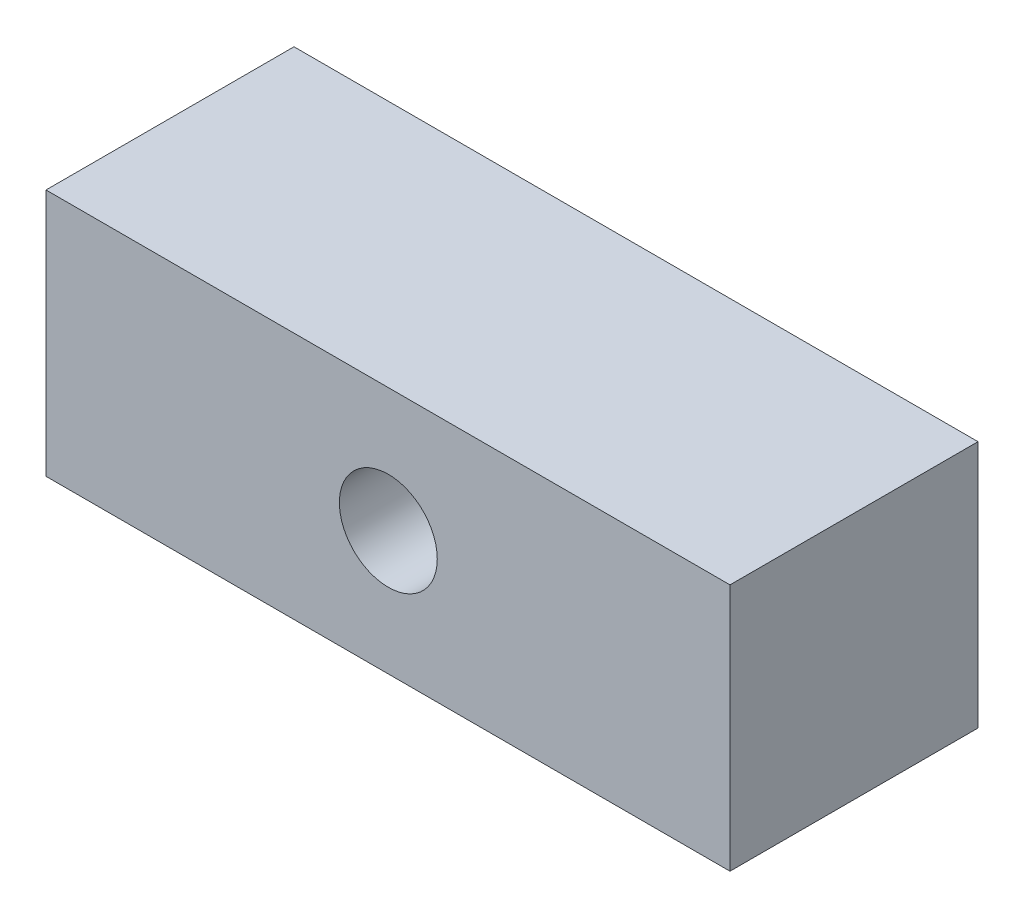
ISO-10303-21;
HEADER;
FILE_DESCRIPTION(('STEP AP214'),'2;1');
FILE_NAME('part.step','',(''),(''),'','','');
FILE_SCHEMA(('AUTOMOTIVE_DESIGN { 1 0 10303 214 1 1 1 1 }'));
ENDSEC;
DATA;
#1=APPLICATION_CONTEXT('core data for automotive mechanical design processes');
#2=APPLICATION_PROTOCOL_DEFINITION('international standard','automotive_design',2000,#1);
#3=PRODUCT_CONTEXT('',#1,'mechanical');
#4=PRODUCT('Part','Part','',(#3));
#5=PRODUCT_RELATED_PRODUCT_CATEGORY('part','',(#4));
#6=PRODUCT_DEFINITION_FORMATION('','',#4);
#7=PRODUCT_DEFINITION_CONTEXT('part definition',#1,'design');
#8=PRODUCT_DEFINITION('design','',#6,#7);
#9=PRODUCT_DEFINITION_SHAPE('','',#8);
#10=(LENGTH_UNIT() NAMED_UNIT(*) SI_UNIT(.MILLI.,.METRE.));
#11=(NAMED_UNIT(*) PLANE_ANGLE_UNIT() SI_UNIT($,.RADIAN.));
#12=(NAMED_UNIT(*) SI_UNIT($,.STERADIAN.) SOLID_ANGLE_UNIT());
#13=UNCERTAINTY_MEASURE_WITH_UNIT(LENGTH_MEASURE(1.E-05),#10,'distance_accuracy_value','');
#14=(GEOMETRIC_REPRESENTATION_CONTEXT(3) GLOBAL_UNCERTAINTY_ASSIGNED_CONTEXT((#13)) GLOBAL_UNIT_ASSIGNED_CONTEXT((#10,
#11,#12)) REPRESENTATION_CONTEXT('',''));
#15=CARTESIAN_POINT('',(0.,0.,0.));
#16=DIRECTION('',(0.,0.,1.));
#17=DIRECTION('',(1.,0.,0.));
#18=AXIS2_PLACEMENT_3D('',#15,#16,#17);
#19=CARTESIAN_POINT('',(0.,0.,38.));
#20=DIRECTION('',(0.,0.,-1.));
#21=DIRECTION('',(-1.,0.,0.));
#22=AXIS2_PLACEMENT_3D('',#19,#20,#21);
#23=PLANE('',#22);
#24=DIRECTION('',(0.,-1.,0.));
#25=VECTOR('',#24,1.);
#26=CARTESIAN_POINT('',(0.,0.,38.));
#27=LINE('',#26,#25);
#28=CARTESIAN_POINT('',(0.,38.,38.));
#29=VERTEX_POINT('',#28);
#30=CARTESIAN_POINT('',(0.,0.,38.));
#31=VERTEX_POINT('',#30);
#32=EDGE_CURVE('E92',#29,#31,#27,.T.);
#33=ORIENTED_EDGE('',*,*,#32,.T.);
#34=DIRECTION('',(1.,0.,0.));
#35=VECTOR('',#34,1.);
#36=CARTESIAN_POINT('',(0.,0.,38.));
#37=LINE('',#36,#35);
#38=CARTESIAN_POINT('',(104.8,0.,38.));
#39=VERTEX_POINT('',#38);
#40=EDGE_CURVE('E87',#31,#39,#37,.T.);
#41=ORIENTED_EDGE('',*,*,#40,.T.);
#42=DIRECTION('',(0.,1.,0.));
#43=VECTOR('',#42,1.);
#44=CARTESIAN_POINT('',(104.8,0.,38.));
#45=LINE('',#44,#43);
#46=CARTESIAN_POINT('',(104.8,38.,38.));
#47=VERTEX_POINT('',#46);
#48=EDGE_CURVE('E90',#39,#47,#45,.T.);
#49=ORIENTED_EDGE('',*,*,#48,.T.);
#50=DIRECTION('',(-1.,0.,0.));
#51=VECTOR('',#50,1.);
#52=CARTESIAN_POINT('',(0.,38.,38.));
#53=LINE('',#52,#51);
#54=EDGE_CURVE('E57',#47,#29,#53,.T.);
#55=ORIENTED_EDGE('',*,*,#54,.T.);
#56=EDGE_LOOP('',(#33,#41,#49,#55));
#57=FACE_BOUND('',#56,.T.);
#58=CARTESIAN_POINT('',(52.45,19.,38.));
#59=DIRECTION('',(0.,0.,1.));
#60=DIRECTION('',(1.,0.,0.));
#61=AXIS2_PLACEMENT_3D('',#58,#59,#60);
#62=CIRCLE('',#61,7.5);
#63=CARTESIAN_POINT('',(59.95,19.,38.));
#64=VERTEX_POINT('',#63);
#65=EDGE_CURVE('E112',#64,#64,#62,.T.);
#66=ORIENTED_EDGE('',*,*,#65,.F.);
#67=EDGE_LOOP('',(#66));
#68=FACE_BOUND('',#67,.T.);
#69=ADVANCED_FACE('F39',(#57,#68),#23,.F.);
#70=CARTESIAN_POINT('',(0.,0.,0.));
#71=DIRECTION('',(0.,0.,-1.));
#72=DIRECTION('',(-1.,0.,0.));
#73=AXIS2_PLACEMENT_3D('',#70,#71,#72);
#74=PLANE('',#73);
#75=DIRECTION('',(0.,-1.,0.));
#76=VECTOR('',#75,1.);
#77=CARTESIAN_POINT('',(0.,0.,0.));
#78=LINE('',#77,#76);
#79=CARTESIAN_POINT('',(0.,38.,0.));
#80=VERTEX_POINT('',#79);
#81=CARTESIAN_POINT('',(0.,0.,0.));
#82=VERTEX_POINT('',#81);
#83=EDGE_CURVE('E108',#80,#82,#78,.T.);
#84=ORIENTED_EDGE('',*,*,#83,.F.);
#85=DIRECTION('',(-1.,0.,0.));
#86=VECTOR('',#85,1.);
#87=CARTESIAN_POINT('',(0.,38.,0.));
#88=LINE('',#87,#86);
#89=CARTESIAN_POINT('',(104.8,38.,0.));
#90=VERTEX_POINT('',#89);
#91=EDGE_CURVE('E80',#90,#80,#88,.T.);
#92=ORIENTED_EDGE('',*,*,#91,.F.);
#93=DIRECTION('',(0.,1.,0.));
#94=VECTOR('',#93,1.);
#95=CARTESIAN_POINT('',(104.8,0.,0.));
#96=LINE('',#95,#94);
#97=CARTESIAN_POINT('',(104.8,0.,0.));
#98=VERTEX_POINT('',#97);
#99=EDGE_CURVE('E74',#98,#90,#96,.T.);
#100=ORIENTED_EDGE('',*,*,#99,.F.);
#101=DIRECTION('',(1.,0.,0.));
#102=VECTOR('',#101,1.);
#103=CARTESIAN_POINT('',(0.,0.,0.));
#104=LINE('',#103,#102);
#105=EDGE_CURVE('E97',#82,#98,#104,.T.);
#106=ORIENTED_EDGE('',*,*,#105,.F.);
#107=EDGE_LOOP('',(#84,#92,#100,#106));
#108=FACE_BOUND('',#107,.T.);
#109=CARTESIAN_POINT('',(52.45,19.,0.));
#110=DIRECTION('',(0.,0.,1.));
#111=DIRECTION('',(1.,0.,0.));
#112=AXIS2_PLACEMENT_3D('',#109,#110,#111);
#113=CIRCLE('',#112,7.5);
#114=CARTESIAN_POINT('',(59.95,19.,0.));
#115=VERTEX_POINT('',#114);
#116=EDGE_CURVE('E130',#115,#115,#113,.T.);
#117=ORIENTED_EDGE('',*,*,#116,.T.);
#118=EDGE_LOOP('',(#117));
#119=FACE_BOUND('',#118,.T.);
#120=ADVANCED_FACE('F125',(#108,#119),#74,.T.);
#121=CARTESIAN_POINT('',(0.,0.,38.));
#122=DIRECTION('',(1.,0.,0.));
#123=DIRECTION('',(0.,0.,-1.));
#124=AXIS2_PLACEMENT_3D('',#121,#122,#123);
#125=PLANE('',#124);
#126=ORIENTED_EDGE('',*,*,#83,.T.);
#127=DIRECTION('',(0.,0.,-1.));
#128=VECTOR('',#127,1.);
#129=CARTESIAN_POINT('',(0.,0.,38.));
#130=LINE('',#129,#128);
#131=EDGE_CURVE('E11',#31,#82,#130,.T.);
#132=ORIENTED_EDGE('',*,*,#131,.F.);
#133=ORIENTED_EDGE('',*,*,#32,.F.);
#134=DIRECTION('',(0.,0.,-1.));
#135=VECTOR('',#134,1.);
#136=CARTESIAN_POINT('',(0.,38.,38.));
#137=LINE('',#136,#135);
#138=EDGE_CURVE('E104',#29,#80,#137,.T.);
#139=ORIENTED_EDGE('',*,*,#138,.T.);
#140=EDGE_LOOP('',(#126,#132,#133,#139));
#141=FACE_BOUND('',#140,.T.);
#142=ADVANCED_FACE('F41',(#141),#125,.F.);
#143=CARTESIAN_POINT('',(0.,0.,38.));
#144=DIRECTION('',(0.,1.,0.));
#145=DIRECTION('',(0.,0.,1.));
#146=AXIS2_PLACEMENT_3D('',#143,#144,#145);
#147=PLANE('',#146);
#148=ORIENTED_EDGE('',*,*,#105,.T.);
#149=DIRECTION('',(0.,0.,-1.));
#150=VECTOR('',#149,1.);
#151=CARTESIAN_POINT('',(104.8,0.,38.));
#152=LINE('',#151,#150);
#153=EDGE_CURVE('E49',#39,#98,#152,.T.);
#154=ORIENTED_EDGE('',*,*,#153,.F.);
#155=ORIENTED_EDGE('',*,*,#40,.F.);
#156=ORIENTED_EDGE('',*,*,#131,.T.);
#157=EDGE_LOOP('',(#148,#154,#155,#156));
#158=FACE_BOUND('',#157,.T.);
#159=ADVANCED_FACE('F96',(#158),#147,.F.);
#160=CARTESIAN_POINT('',(104.8,0.,38.));
#161=DIRECTION('',(-1.,0.,0.));
#162=DIRECTION('',(0.,-1.,0.));
#163=AXIS2_PLACEMENT_3D('',#160,#161,#162);
#164=PLANE('',#163);
#165=ORIENTED_EDGE('',*,*,#99,.T.);
#166=DIRECTION('',(0.,0.,-1.));
#167=VECTOR('',#166,1.);
#168=CARTESIAN_POINT('',(104.8,38.,38.));
#169=LINE('',#168,#167);
#170=EDGE_CURVE('E99',#47,#90,#169,.T.);
#171=ORIENTED_EDGE('',*,*,#170,.F.);
#172=ORIENTED_EDGE('',*,*,#48,.F.);
#173=ORIENTED_EDGE('',*,*,#153,.T.);
#174=EDGE_LOOP('',(#165,#171,#172,#173));
#175=FACE_BOUND('',#174,.T.);
#176=ADVANCED_FACE('F100',(#175),#164,.F.);
#177=CARTESIAN_POINT('',(0.,38.,38.));
#178=DIRECTION('',(0.,-1.,0.));
#179=DIRECTION('',(0.,0.,-1.));
#180=AXIS2_PLACEMENT_3D('',#177,#178,#179);
#181=PLANE('',#180);
#182=ORIENTED_EDGE('',*,*,#91,.T.);
#183=ORIENTED_EDGE('',*,*,#138,.F.);
#184=ORIENTED_EDGE('',*,*,#54,.F.);
#185=ORIENTED_EDGE('',*,*,#170,.T.);
#186=EDGE_LOOP('',(#182,#183,#184,#185));
#187=FACE_BOUND('',#186,.T.);
#188=ADVANCED_FACE('F122',(#187),#181,.F.);
#189=CARTESIAN_POINT('',(52.45,19.,38.));
#190=DIRECTION('',(0.,0.,-1.));
#191=DIRECTION('',(-1.,0.,0.));
#192=AXIS2_PLACEMENT_3D('',#189,#190,#191);
#193=CYLINDRICAL_SURFACE('',#192,7.5);
#194=ORIENTED_EDGE('',*,*,#65,.T.);
#195=EDGE_LOOP('',(#194));
#196=FACE_BOUND('',#195,.T.);
#197=ORIENTED_EDGE('',*,*,#116,.F.);
#198=EDGE_LOOP('',(#197));
#199=FACE_BOUND('',#198,.T.);
#200=ADVANCED_FACE('F138',(#196,#199),#193,.F.);
#201=CLOSED_SHELL('',(#69,#120,#142,#159,#176,#188,#200));
#202=MANIFOLD_SOLID_BREP('B2',#201);
#203=ADVANCED_BREP_SHAPE_REPRESENTATION('',(#18,#202),#14);
#204=SHAPE_DEFINITION_REPRESENTATION(#9,#203);
ENDSEC;
END-ISO-10303-21;
